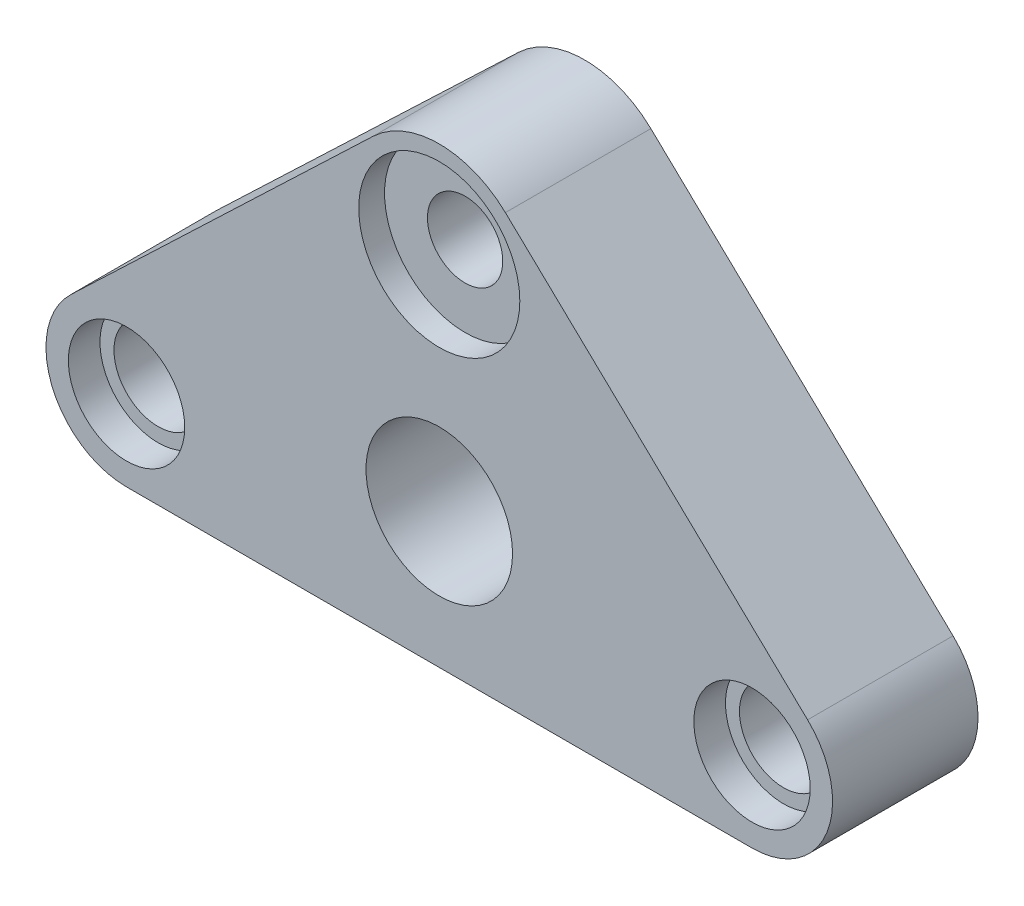
ISO-10303-21;
HEADER;
FILE_DESCRIPTION(('STEP AP214'),'2;1');
FILE_NAME('part.step','',(''),(''),'','','');
FILE_SCHEMA(('AUTOMOTIVE_DESIGN { 1 0 10303 214 1 1 1 1 }'));
ENDSEC;
DATA;
#1=APPLICATION_CONTEXT('core data for automotive mechanical design processes');
#2=APPLICATION_PROTOCOL_DEFINITION('international standard','automotive_design',2000,#1);
#3=PRODUCT_CONTEXT('',#1,'mechanical');
#4=PRODUCT('Part','Part','',(#3));
#5=PRODUCT_RELATED_PRODUCT_CATEGORY('part','',(#4));
#6=PRODUCT_DEFINITION_FORMATION('','',#4);
#7=PRODUCT_DEFINITION_CONTEXT('part definition',#1,'design');
#8=PRODUCT_DEFINITION('design','',#6,#7);
#9=PRODUCT_DEFINITION_SHAPE('','',#8);
#10=(LENGTH_UNIT() NAMED_UNIT(*) SI_UNIT(.MILLI.,.METRE.));
#11=(NAMED_UNIT(*) PLANE_ANGLE_UNIT() SI_UNIT($,.RADIAN.));
#12=(NAMED_UNIT(*) SI_UNIT($,.STERADIAN.) SOLID_ANGLE_UNIT());
#13=UNCERTAINTY_MEASURE_WITH_UNIT(LENGTH_MEASURE(1.E-05),#10,'distance_accuracy_value','');
#14=(GEOMETRIC_REPRESENTATION_CONTEXT(3) GLOBAL_UNCERTAINTY_ASSIGNED_CONTEXT((#13)) GLOBAL_UNIT_ASSIGNED_CONTEXT((#10,
#11,#12)) REPRESENTATION_CONTEXT('',''));
#15=CARTESIAN_POINT('',(0.,0.,0.));
#16=DIRECTION('',(0.,0.,1.));
#17=DIRECTION('',(1.,0.,0.));
#18=AXIS2_PLACEMENT_3D('',#15,#16,#17);
#19=CARTESIAN_POINT('',(43.,-38.0985892127255,20.));
#20=DIRECTION('',(0.,0.,-1.));
#21=DIRECTION('',(-1.,0.,0.));
#22=AXIS2_PLACEMENT_3D('',#19,#20,#21);
#23=CYLINDRICAL_SURFACE('',#22,6.075);
#24=CARTESIAN_POINT('',(43.,-38.0985892127255,4.35));
#25=DIRECTION('',(0.,0.,-1.));
#26=DIRECTION('',(-1.,0.,0.));
#27=AXIS2_PLACEMENT_3D('',#24,#25,#26);
#28=CIRCLE('',#27,6.075);
#29=CARTESIAN_POINT('',(36.925,-38.0985892127255,4.35));
#30=VERTEX_POINT('',#29);
#31=EDGE_CURVE('E148',#30,#30,#28,.T.);
#32=ORIENTED_EDGE('',*,*,#31,.T.);
#33=EDGE_LOOP('',(#32));
#34=FACE_BOUND('',#33,.T.);
#35=CARTESIAN_POINT('',(43.,-38.0985892127255,15.65));
#36=DIRECTION('',(0.,0.,1.));
#37=DIRECTION('',(1.,0.,0.));
#38=AXIS2_PLACEMENT_3D('',#35,#36,#37);
#39=CIRCLE('',#38,6.075);
#40=CARTESIAN_POINT('',(49.075,-38.0985892127255,15.65));
#41=VERTEX_POINT('',#40);
#42=EDGE_CURVE('E39',#41,#41,#39,.T.);
#43=ORIENTED_EDGE('',*,*,#42,.T.);
#44=EDGE_LOOP('',(#43));
#45=FACE_BOUND('',#44,.T.);
#46=ADVANCED_FACE('F35',(#34,#45),#23,.F.);
#47=CARTESIAN_POINT('',(-43.,-38.0985892127255,20.));
#48=DIRECTION('',(0.,0.,-1.));
#49=DIRECTION('',(-1.,0.,0.));
#50=AXIS2_PLACEMENT_3D('',#47,#48,#49);
#51=CYLINDRICAL_SURFACE('',#50,6.075);
#52=CARTESIAN_POINT('',(-43.,-38.0985892127255,4.35));
#53=DIRECTION('',(0.,0.,-1.));
#54=DIRECTION('',(-1.,0.,0.));
#55=AXIS2_PLACEMENT_3D('',#52,#53,#54);
#56=CIRCLE('',#55,6.075);
#57=CARTESIAN_POINT('',(-49.075,-38.0985892127255,4.35));
#58=VERTEX_POINT('',#57);
#59=EDGE_CURVE('E143',#58,#58,#56,.T.);
#60=ORIENTED_EDGE('',*,*,#59,.T.);
#61=EDGE_LOOP('',(#60));
#62=FACE_BOUND('',#61,.T.);
#63=CARTESIAN_POINT('',(-43.,-38.0985892127255,15.65));
#64=DIRECTION('',(0.,0.,1.));
#65=DIRECTION('',(1.,0.,0.));
#66=AXIS2_PLACEMENT_3D('',#63,#64,#65);
#67=CIRCLE('',#66,6.075);
#68=CARTESIAN_POINT('',(-36.925,-38.0985892127255,15.65));
#69=VERTEX_POINT('',#68);
#70=EDGE_CURVE('E152',#69,#69,#67,.T.);
#71=ORIENTED_EDGE('',*,*,#70,.T.);
#72=EDGE_LOOP('',(#71));
#73=FACE_BOUND('',#72,.T.);
#74=ADVANCED_FACE('F209',(#62,#73),#51,.F.);
#75=CARTESIAN_POINT('',(0.,0.,20.));
#76=DIRECTION('',(0.,0.,-1.));
#77=DIRECTION('',(-1.,0.,0.));
#78=AXIS2_PLACEMENT_3D('',#75,#76,#77);
#79=CYLINDRICAL_SURFACE('',#78,5.175);
#80=CARTESIAN_POINT('',(0.,0.,0.));
#81=DIRECTION('',(0.,0.,1.));
#82=DIRECTION('',(1.,0.,0.));
#83=AXIS2_PLACEMENT_3D('',#80,#81,#82);
#84=CIRCLE('',#83,5.175);
#85=CARTESIAN_POINT('',(5.175,0.,0.));
#86=VERTEX_POINT('',#85);
#87=EDGE_CURVE('E126',#86,#86,#84,.T.);
#88=ORIENTED_EDGE('',*,*,#87,.F.);
#89=EDGE_LOOP('',(#88));
#90=FACE_BOUND('',#89,.T.);
#91=CARTESIAN_POINT('',(0.,0.,16.45));
#92=DIRECTION('',(0.,0.,1.));
#93=DIRECTION('',(1.,0.,0.));
#94=AXIS2_PLACEMENT_3D('',#91,#92,#93);
#95=CIRCLE('',#94,5.175);
#96=CARTESIAN_POINT('',(5.175,0.,16.45));
#97=VERTEX_POINT('',#96);
#98=EDGE_CURVE('E139',#97,#97,#95,.T.);
#99=ORIENTED_EDGE('',*,*,#98,.T.);
#100=EDGE_LOOP('',(#99));
#101=FACE_BOUND('',#100,.T.);
#102=ADVANCED_FACE('F215',(#90,#101),#79,.F.);
#103=CARTESIAN_POINT('',(0.,0.,20.));
#104=DIRECTION('',(0.,0.,1.));
#105=DIRECTION('',(1.,0.,0.));
#106=AXIS2_PLACEMENT_3D('',#103,#104,#105);
#107=PLANE('',#106);
#108=CARTESIAN_POINT('',(0.,-30.5935892127255,20.));
#109=DIRECTION('',(0.,0.,1.));
#110=DIRECTION('',(1.,0.,0.));
#111=AXIS2_PLACEMENT_3D('',#108,#109,#110);
#112=CIRCLE('',#111,10.075);
#113=CARTESIAN_POINT('',(10.075,-30.5935892127255,20.));
#114=VERTEX_POINT('',#113);
#115=EDGE_CURVE('E297',#114,#114,#112,.T.);
#116=ORIENTED_EDGE('',*,*,#115,.F.);
#117=EDGE_LOOP('',(#116));
#118=FACE_BOUND('',#117,.T.);
#119=CARTESIAN_POINT('',(43.,-38.0985892127255,20.));
#120=DIRECTION('',(0.,0.,1.));
#121=DIRECTION('',(1.,0.,0.));
#122=AXIS2_PLACEMENT_3D('',#119,#120,#121);
#123=CIRCLE('',#122,8.);
#124=CARTESIAN_POINT('',(51.,-38.0985892127255,20.));
#125=VERTEX_POINT('',#124);
#126=EDGE_CURVE('E168',#125,#125,#123,.T.);
#127=ORIENTED_EDGE('',*,*,#126,.F.);
#128=EDGE_LOOP('',(#127));
#129=FACE_BOUND('',#128,.T.);
#130=CARTESIAN_POINT('',(-43.,-38.0985892127255,20.));
#131=DIRECTION('',(0.,0.,1.));
#132=DIRECTION('',(1.,0.,0.));
#133=AXIS2_PLACEMENT_3D('',#130,#131,#132);
#134=CIRCLE('',#133,8.);
#135=CARTESIAN_POINT('',(-35.,-38.0985892127255,20.));
#136=VERTEX_POINT('',#135);
#137=EDGE_CURVE('E161',#136,#136,#134,.T.);
#138=ORIENTED_EDGE('',*,*,#137,.F.);
#139=EDGE_LOOP('',(#138));
#140=FACE_BOUND('',#139,.T.);
#141=CARTESIAN_POINT('',(0.,0.,20.));
#142=DIRECTION('',(0.,0.,1.));
#143=DIRECTION('',(1.,0.,0.));
#144=AXIS2_PLACEMENT_3D('',#141,#142,#143);
#145=CIRCLE('',#144,11.075);
#146=CARTESIAN_POINT('',(11.075,0.,20.));
#147=VERTEX_POINT('',#146);
#148=EDGE_CURVE('E146',#147,#147,#145,.T.);
#149=ORIENTED_EDGE('',*,*,#148,.F.);
#150=EDGE_LOOP('',(#149));
#151=FACE_BOUND('',#150,.T.);
#152=CARTESIAN_POINT('',(0.,0.,20.));
#153=DIRECTION('',(0.,0.,1.));
#154=DIRECTION('',(1.,0.,0.));
#155=AXIS2_PLACEMENT_3D('',#152,#153,#154);
#156=CIRCLE('',#155,13.175);
#157=CARTESIAN_POINT('',(9.09176578504744,9.53521997175948,20.));
#158=VERTEX_POINT('',#157);
#159=CARTESIAN_POINT('',(-9.09176578504744,9.53521997175948,20.));
#160=VERTEX_POINT('',#159);
#161=EDGE_CURVE('E133',#158,#160,#156,.T.);
#162=ORIENTED_EDGE('',*,*,#161,.T.);
#163=DIRECTION('',(-0.723735861234116,-0.690077099434341,0.));
#164=VECTOR('',#163,1.);
#165=CARTESIAN_POINT('',(-9.09176578504744,9.53521997175948,20.));
#166=LINE('',#165,#164);
#167=CARTESIAN_POINT('',(-50.6426038762353,-30.0832145495576,20.));
#168=VERTEX_POINT('',#167);
#169=EDGE_CURVE('E91',#160,#168,#166,.T.);
#170=ORIENTED_EDGE('',*,*,#169,.T.);
#171=CARTESIAN_POINT('',(-43.,-38.0985892127255,20.));
#172=DIRECTION('',(0.,0.,1.));
#173=DIRECTION('',(1.,0.,0.));
#174=AXIS2_PLACEMENT_3D('',#171,#172,#173);
#175=CIRCLE('',#174,11.075);
#176=CARTESIAN_POINT('',(-43.,-49.1735892127255,20.));
#177=VERTEX_POINT('',#176);
#178=EDGE_CURVE('E104',#168,#177,#175,.T.);
#179=ORIENTED_EDGE('',*,*,#178,.T.);
#180=DIRECTION('',(1.,0.,0.));
#181=VECTOR('',#180,1.);
#182=CARTESIAN_POINT('',(-43.,-49.1735892127255,20.));
#183=LINE('',#182,#181);
#184=CARTESIAN_POINT('',(43.,-49.1735892127254,20.));
#185=VERTEX_POINT('',#184);
#186=EDGE_CURVE('E98',#177,#185,#183,.T.);
#187=ORIENTED_EDGE('',*,*,#186,.T.);
#188=CARTESIAN_POINT('',(43.,-38.0985892127255,20.));
#189=DIRECTION('',(0.,0.,1.));
#190=DIRECTION('',(1.,0.,0.));
#191=AXIS2_PLACEMENT_3D('',#188,#189,#190);
#192=CIRCLE('',#191,11.075);
#193=CARTESIAN_POINT('',(50.6426038762353,-30.0832145495576,20.));
#194=VERTEX_POINT('',#193);
#195=EDGE_CURVE('E102',#185,#194,#192,.T.);
#196=ORIENTED_EDGE('',*,*,#195,.T.);
#197=DIRECTION('',(-0.723735861234116,0.690077099434341,0.));
#198=VECTOR('',#197,1.);
#199=CARTESIAN_POINT('',(9.09176578504744,9.53521997175948,20.));
#200=LINE('',#199,#198);
#201=EDGE_CURVE('E54',#194,#158,#200,.T.);
#202=ORIENTED_EDGE('',*,*,#201,.T.);
#203=EDGE_LOOP('',(#162,#170,#179,#187,#196,#202));
#204=FACE_BOUND('',#203,.T.);
#205=ADVANCED_FACE('F100',(#118,#129,#140,#151,#204),#107,.T.);
#206=CARTESIAN_POINT('',(0.,0.,0.));
#207=DIRECTION('',(0.,0.,1.));
#208=DIRECTION('',(1.,0.,0.));
#209=AXIS2_PLACEMENT_3D('',#206,#207,#208);
#210=PLANE('',#209);
#211=CARTESIAN_POINT('',(0.,-30.5935892127255,0.));
#212=DIRECTION('',(0.,0.,1.));
#213=DIRECTION('',(1.,0.,0.));
#214=AXIS2_PLACEMENT_3D('',#211,#212,#213);
#215=CIRCLE('',#214,1.75);
#216=CARTESIAN_POINT('',(1.75,-30.5935892127255,0.));
#217=VERTEX_POINT('',#216);
#218=EDGE_CURVE('E235',#217,#217,#215,.F.);
#219=ORIENTED_EDGE('',*,*,#218,.F.);
#220=EDGE_LOOP('',(#219));
#221=FACE_BOUND('',#220,.T.);
#222=CARTESIAN_POINT('',(43.,-38.0985892127255,0.));
#223=DIRECTION('',(0.,0.,-1.));
#224=DIRECTION('',(-1.,0.,0.));
#225=AXIS2_PLACEMENT_3D('',#222,#223,#224);
#226=CIRCLE('',#225,8.);
#227=CARTESIAN_POINT('',(35.,-38.0985892127255,0.));
#228=VERTEX_POINT('',#227);
#229=EDGE_CURVE('E154',#228,#228,#226,.T.);
#230=ORIENTED_EDGE('',*,*,#229,.F.);
#231=EDGE_LOOP('',(#230));
#232=FACE_BOUND('',#231,.T.);
#233=CARTESIAN_POINT('',(-43.,-38.0985892127255,0.));
#234=DIRECTION('',(0.,0.,-1.));
#235=DIRECTION('',(-1.,0.,0.));
#236=AXIS2_PLACEMENT_3D('',#233,#234,#235);
#237=CIRCLE('',#236,8.);
#238=CARTESIAN_POINT('',(-51.,-38.0985892127255,0.));
#239=VERTEX_POINT('',#238);
#240=EDGE_CURVE('E150',#239,#239,#237,.T.);
#241=ORIENTED_EDGE('',*,*,#240,.F.);
#242=EDGE_LOOP('',(#241));
#243=FACE_BOUND('',#242,.T.);
#244=CARTESIAN_POINT('',(0.,0.,0.));
#245=DIRECTION('',(0.,0.,1.));
#246=DIRECTION('',(1.,0.,0.));
#247=AXIS2_PLACEMENT_3D('',#244,#245,#246);
#248=CIRCLE('',#247,13.175);
#249=CARTESIAN_POINT('',(9.09176578504744,9.53521997175948,0.));
#250=VERTEX_POINT('',#249);
#251=CARTESIAN_POINT('',(-9.09176578504744,9.53521997175948,0.));
#252=VERTEX_POINT('',#251);
#253=EDGE_CURVE('E122',#250,#252,#248,.T.);
#254=ORIENTED_EDGE('',*,*,#253,.F.);
#255=DIRECTION('',(-0.723735861234116,0.690077099434341,0.));
#256=VECTOR('',#255,1.);
#257=CARTESIAN_POINT('',(9.09176578504744,9.53521997175948,0.));
#258=LINE('',#257,#256);
#259=CARTESIAN_POINT('',(50.6426038762353,-30.0832145495576,0.));
#260=VERTEX_POINT('',#259);
#261=EDGE_CURVE('E83',#260,#250,#258,.T.);
#262=ORIENTED_EDGE('',*,*,#261,.F.);
#263=CARTESIAN_POINT('',(43.,-38.0985892127255,0.));
#264=DIRECTION('',(0.,0.,1.));
#265=DIRECTION('',(1.,0.,0.));
#266=AXIS2_PLACEMENT_3D('',#263,#264,#265);
#267=CIRCLE('',#266,11.075);
#268=CARTESIAN_POINT('',(43.,-49.1735892127254,0.));
#269=VERTEX_POINT('',#268);
#270=EDGE_CURVE('E77',#269,#260,#267,.T.);
#271=ORIENTED_EDGE('',*,*,#270,.F.);
#272=DIRECTION('',(1.,0.,0.));
#273=VECTOR('',#272,1.);
#274=CARTESIAN_POINT('',(-43.,-49.1735892127255,0.));
#275=LINE('',#274,#273);
#276=CARTESIAN_POINT('',(-43.,-49.1735892127255,0.));
#277=VERTEX_POINT('',#276);
#278=EDGE_CURVE('E112',#277,#269,#275,.T.);
#279=ORIENTED_EDGE('',*,*,#278,.F.);
#280=CARTESIAN_POINT('',(-43.,-38.0985892127255,0.));
#281=DIRECTION('',(0.,0.,1.));
#282=DIRECTION('',(1.,0.,0.));
#283=AXIS2_PLACEMENT_3D('',#280,#281,#282);
#284=CIRCLE('',#283,11.075);
#285=CARTESIAN_POINT('',(-50.6426038762353,-30.0832145495576,0.));
#286=VERTEX_POINT('',#285);
#287=EDGE_CURVE('E128',#286,#277,#284,.T.);
#288=ORIENTED_EDGE('',*,*,#287,.F.);
#289=DIRECTION('',(-0.723735861234116,-0.690077099434341,0.));
#290=VECTOR('',#289,1.);
#291=CARTESIAN_POINT('',(-9.09176578504744,9.53521997175948,0.));
#292=LINE('',#291,#290);
#293=EDGE_CURVE('E125',#252,#286,#292,.T.);
#294=ORIENTED_EDGE('',*,*,#293,.F.);
#295=EDGE_LOOP('',(#254,#262,#271,#279,#288,#294));
#296=FACE_BOUND('',#295,.T.);
#297=ORIENTED_EDGE('',*,*,#87,.T.);
#298=EDGE_LOOP('',(#297));
#299=FACE_BOUND('',#298,.T.);
#300=ADVANCED_FACE('F192',(#221,#232,#243,#296,#299),#210,.F.);
#301=CARTESIAN_POINT('',(0.,0.,20.));
#302=DIRECTION('',(0.,0.,-1.));
#303=DIRECTION('',(-1.,0.,0.));
#304=AXIS2_PLACEMENT_3D('',#301,#302,#303);
#305=CYLINDRICAL_SURFACE('',#304,13.175);
#306=ORIENTED_EDGE('',*,*,#253,.T.);
#307=DIRECTION('',(0.,0.,-1.));
#308=VECTOR('',#307,1.);
#309=CARTESIAN_POINT('',(-9.09176578504744,9.53521997175948,20.));
#310=LINE('',#309,#308);
#311=EDGE_CURVE('E11',#160,#252,#310,.T.);
#312=ORIENTED_EDGE('',*,*,#311,.F.);
#313=ORIENTED_EDGE('',*,*,#161,.F.);
#314=DIRECTION('',(0.,0.,-1.));
#315=VECTOR('',#314,1.);
#316=CARTESIAN_POINT('',(9.09176578504744,9.53521997175948,20.));
#317=LINE('',#316,#315);
#318=EDGE_CURVE('E118',#158,#250,#317,.T.);
#319=ORIENTED_EDGE('',*,*,#318,.T.);
#320=EDGE_LOOP('',(#306,#312,#313,#319));
#321=FACE_BOUND('',#320,.T.);
#322=ADVANCED_FACE('F37',(#321),#305,.T.);
#323=CARTESIAN_POINT('',(-9.09176578504744,9.53521997175948,20.));
#324=DIRECTION('',(0.690077099434341,-0.723735861234116,0.));
#325=DIRECTION('',(0.723735861234116,0.690077099434341,0.));
#326=AXIS2_PLACEMENT_3D('',#323,#324,#325);
#327=PLANE('',#326);
#328=ORIENTED_EDGE('',*,*,#293,.T.);
#329=DIRECTION('',(0.,0.,-1.));
#330=VECTOR('',#329,1.);
#331=CARTESIAN_POINT('',(-50.6426038762353,-30.0832145495576,20.));
#332=LINE('',#331,#330);
#333=EDGE_CURVE('E45',#168,#286,#332,.T.);
#334=ORIENTED_EDGE('',*,*,#333,.F.);
#335=ORIENTED_EDGE('',*,*,#169,.F.);
#336=ORIENTED_EDGE('',*,*,#311,.T.);
#337=EDGE_LOOP('',(#328,#334,#335,#336));
#338=FACE_BOUND('',#337,.T.);
#339=ADVANCED_FACE('F186',(#338),#327,.F.);
#340=CARTESIAN_POINT('',(-43.,-38.0985892127255,20.));
#341=DIRECTION('',(0.,0.,-1.));
#342=DIRECTION('',(-1.,0.,0.));
#343=AXIS2_PLACEMENT_3D('',#340,#341,#342);
#344=CYLINDRICAL_SURFACE('',#343,11.075);
#345=ORIENTED_EDGE('',*,*,#287,.T.);
#346=DIRECTION('',(0.,0.,-1.));
#347=VECTOR('',#346,1.);
#348=CARTESIAN_POINT('',(-43.,-49.1735892127255,20.));
#349=LINE('',#348,#347);
#350=EDGE_CURVE('E113',#177,#277,#349,.T.);
#351=ORIENTED_EDGE('',*,*,#350,.F.);
#352=ORIENTED_EDGE('',*,*,#178,.F.);
#353=ORIENTED_EDGE('',*,*,#333,.T.);
#354=EDGE_LOOP('',(#345,#351,#352,#353));
#355=FACE_BOUND('',#354,.T.);
#356=ADVANCED_FACE('F189',(#355),#344,.T.);
#357=CARTESIAN_POINT('',(-43.,-49.1735892127255,20.));
#358=DIRECTION('',(0.,1.,0.));
#359=DIRECTION('',(-1.,0.,0.));
#360=AXIS2_PLACEMENT_3D('',#357,#358,#359);
#361=PLANE('',#360);
#362=ORIENTED_EDGE('',*,*,#278,.T.);
#363=DIRECTION('',(0.,0.,-1.));
#364=VECTOR('',#363,1.);
#365=CARTESIAN_POINT('',(43.,-49.1735892127254,20.));
#366=LINE('',#365,#364);
#367=EDGE_CURVE('E109',#185,#269,#366,.T.);
#368=ORIENTED_EDGE('',*,*,#367,.F.);
#369=ORIENTED_EDGE('',*,*,#186,.F.);
#370=ORIENTED_EDGE('',*,*,#350,.T.);
#371=EDGE_LOOP('',(#362,#368,#369,#370));
#372=FACE_BOUND('',#371,.T.);
#373=ADVANCED_FACE('F110',(#372),#361,.F.);
#374=CARTESIAN_POINT('',(43.,-38.0985892127255,20.));
#375=DIRECTION('',(0.,0.,-1.));
#376=DIRECTION('',(-1.,0.,0.));
#377=AXIS2_PLACEMENT_3D('',#374,#375,#376);
#378=CYLINDRICAL_SURFACE('',#377,11.075);
#379=ORIENTED_EDGE('',*,*,#270,.T.);
#380=DIRECTION('',(0.,0.,-1.));
#381=VECTOR('',#380,1.);
#382=CARTESIAN_POINT('',(50.6426038762353,-30.0832145495576,20.));
#383=LINE('',#382,#381);
#384=EDGE_CURVE('E114',#194,#260,#383,.T.);
#385=ORIENTED_EDGE('',*,*,#384,.F.);
#386=ORIENTED_EDGE('',*,*,#195,.F.);
#387=ORIENTED_EDGE('',*,*,#367,.T.);
#388=EDGE_LOOP('',(#379,#385,#386,#387));
#389=FACE_BOUND('',#388,.T.);
#390=ADVANCED_FACE('F116',(#389),#378,.T.);
#391=CARTESIAN_POINT('',(9.09176578504744,9.53521997175948,20.));
#392=DIRECTION('',(-0.690077099434341,-0.723735861234116,0.));
#393=DIRECTION('',(0.723735861234116,-0.690077099434341,0.));
#394=AXIS2_PLACEMENT_3D('',#391,#392,#393);
#395=PLANE('',#394);
#396=ORIENTED_EDGE('',*,*,#261,.T.);
#397=ORIENTED_EDGE('',*,*,#318,.F.);
#398=ORIENTED_EDGE('',*,*,#201,.F.);
#399=ORIENTED_EDGE('',*,*,#384,.T.);
#400=EDGE_LOOP('',(#396,#397,#398,#399));
#401=FACE_BOUND('',#400,.T.);
#402=ADVANCED_FACE('F195',(#401),#395,.F.);
#403=CARTESIAN_POINT('',(0.,0.,16.45));
#404=DIRECTION('',(0.,0.,1.));
#405=DIRECTION('',(1.,0.,0.));
#406=AXIS2_PLACEMENT_3D('',#403,#404,#405);
#407=CYLINDRICAL_SURFACE('',#406,11.075);
#408=CARTESIAN_POINT('',(0.,0.,16.45));
#409=DIRECTION('',(0.,0.,1.));
#410=DIRECTION('',(1.,0.,0.));
#411=AXIS2_PLACEMENT_3D('',#408,#409,#410);
#412=CIRCLE('',#411,11.075);
#413=CARTESIAN_POINT('',(11.075,0.,16.45));
#414=VERTEX_POINT('',#413);
#415=EDGE_CURVE('E142',#414,#414,#412,.T.);
#416=ORIENTED_EDGE('',*,*,#415,.F.);
#417=EDGE_LOOP('',(#416));
#418=FACE_BOUND('',#417,.T.);
#419=ORIENTED_EDGE('',*,*,#148,.T.);
#420=EDGE_LOOP('',(#419));
#421=FACE_BOUND('',#420,.T.);
#422=ADVANCED_FACE('F197',(#418,#421),#407,.F.);
#423=CARTESIAN_POINT('',(0.,0.,16.45));
#424=DIRECTION('',(0.,0.,1.));
#425=DIRECTION('',(1.,0.,0.));
#426=AXIS2_PLACEMENT_3D('',#423,#424,#425);
#427=PLANE('',#426);
#428=ORIENTED_EDGE('',*,*,#98,.F.);
#429=EDGE_LOOP('',(#428));
#430=FACE_BOUND('',#429,.T.);
#431=ORIENTED_EDGE('',*,*,#415,.T.);
#432=EDGE_LOOP('',(#431));
#433=FACE_BOUND('',#432,.T.);
#434=ADVANCED_FACE('F203',(#430,#433),#427,.T.);
#435=CARTESIAN_POINT('',(-43.,-38.0985892127255,4.35));
#436=DIRECTION('',(0.,0.,-1.));
#437=DIRECTION('',(-1.,0.,0.));
#438=AXIS2_PLACEMENT_3D('',#435,#436,#437);
#439=CYLINDRICAL_SURFACE('',#438,8.);
#440=CARTESIAN_POINT('',(-43.,-38.0985892127255,4.35));
#441=DIRECTION('',(0.,0.,-1.));
#442=DIRECTION('',(-1.,0.,0.));
#443=AXIS2_PLACEMENT_3D('',#440,#441,#442);
#444=CIRCLE('',#443,8.);
#445=CARTESIAN_POINT('',(-51.,-38.0985892127255,4.35));
#446=VERTEX_POINT('',#445);
#447=EDGE_CURVE('E147',#446,#446,#444,.T.);
#448=ORIENTED_EDGE('',*,*,#447,.F.);
#449=EDGE_LOOP('',(#448));
#450=FACE_BOUND('',#449,.T.);
#451=ORIENTED_EDGE('',*,*,#240,.T.);
#452=EDGE_LOOP('',(#451));
#453=FACE_BOUND('',#452,.T.);
#454=ADVANCED_FACE('F240',(#450,#453),#439,.F.);
#455=CARTESIAN_POINT('',(-43.,-38.0985892127255,4.35));
#456=DIRECTION('',(0.,0.,-1.));
#457=DIRECTION('',(-1.,0.,0.));
#458=AXIS2_PLACEMENT_3D('',#455,#456,#457);
#459=PLANE('',#458);
#460=ORIENTED_EDGE('',*,*,#59,.F.);
#461=EDGE_LOOP('',(#460));
#462=FACE_BOUND('',#461,.T.);
#463=ORIENTED_EDGE('',*,*,#447,.T.);
#464=EDGE_LOOP('',(#463));
#465=FACE_BOUND('',#464,.T.);
#466=ADVANCED_FACE('F242',(#462,#465),#459,.T.);
#467=CARTESIAN_POINT('',(43.,-38.0985892127255,4.35));
#468=DIRECTION('',(0.,0.,-1.));
#469=DIRECTION('',(-1.,0.,0.));
#470=AXIS2_PLACEMENT_3D('',#467,#468,#469);
#471=CYLINDRICAL_SURFACE('',#470,8.);
#472=CARTESIAN_POINT('',(43.,-38.0985892127255,4.35));
#473=DIRECTION('',(0.,0.,-1.));
#474=DIRECTION('',(-1.,0.,0.));
#475=AXIS2_PLACEMENT_3D('',#472,#473,#474);
#476=CIRCLE('',#475,8.);
#477=CARTESIAN_POINT('',(35.,-38.0985892127255,4.35));
#478=VERTEX_POINT('',#477);
#479=EDGE_CURVE('E151',#478,#478,#476,.T.);
#480=ORIENTED_EDGE('',*,*,#479,.F.);
#481=EDGE_LOOP('',(#480));
#482=FACE_BOUND('',#481,.T.);
#483=ORIENTED_EDGE('',*,*,#229,.T.);
#484=EDGE_LOOP('',(#483));
#485=FACE_BOUND('',#484,.T.);
#486=ADVANCED_FACE('F249',(#482,#485),#471,.F.);
#487=CARTESIAN_POINT('',(43.,-38.0985892127255,4.35));
#488=DIRECTION('',(0.,0.,-1.));
#489=DIRECTION('',(-1.,0.,0.));
#490=AXIS2_PLACEMENT_3D('',#487,#488,#489);
#491=PLANE('',#490);
#492=ORIENTED_EDGE('',*,*,#31,.F.);
#493=EDGE_LOOP('',(#492));
#494=FACE_BOUND('',#493,.T.);
#495=ORIENTED_EDGE('',*,*,#479,.T.);
#496=EDGE_LOOP('',(#495));
#497=FACE_BOUND('',#496,.T.);
#498=ADVANCED_FACE('F258',(#494,#497),#491,.T.);
#499=CARTESIAN_POINT('',(-43.,-38.0985892127255,15.65));
#500=DIRECTION('',(0.,0.,1.));
#501=DIRECTION('',(1.,0.,0.));
#502=AXIS2_PLACEMENT_3D('',#499,#500,#501);
#503=CYLINDRICAL_SURFACE('',#502,8.);
#504=CARTESIAN_POINT('',(-43.,-38.0985892127255,15.65));
#505=DIRECTION('',(0.,0.,1.));
#506=DIRECTION('',(1.,0.,0.));
#507=AXIS2_PLACEMENT_3D('',#504,#505,#506);
#508=CIRCLE('',#507,8.);
#509=CARTESIAN_POINT('',(-35.,-38.0985892127255,15.65));
#510=VERTEX_POINT('',#509);
#511=EDGE_CURVE('E155',#510,#510,#508,.T.);
#512=ORIENTED_EDGE('',*,*,#511,.F.);
#513=EDGE_LOOP('',(#512));
#514=FACE_BOUND('',#513,.T.);
#515=ORIENTED_EDGE('',*,*,#137,.T.);
#516=EDGE_LOOP('',(#515));
#517=FACE_BOUND('',#516,.T.);
#518=ADVANCED_FACE('F262',(#514,#517),#503,.F.);
#519=CARTESIAN_POINT('',(-43.,-38.0985892127255,15.65));
#520=DIRECTION('',(0.,0.,1.));
#521=DIRECTION('',(1.,0.,0.));
#522=AXIS2_PLACEMENT_3D('',#519,#520,#521);
#523=PLANE('',#522);
#524=ORIENTED_EDGE('',*,*,#70,.F.);
#525=EDGE_LOOP('',(#524));
#526=FACE_BOUND('',#525,.T.);
#527=ORIENTED_EDGE('',*,*,#511,.T.);
#528=EDGE_LOOP('',(#527));
#529=FACE_BOUND('',#528,.T.);
#530=ADVANCED_FACE('F266',(#526,#529),#523,.T.);
#531=CARTESIAN_POINT('',(43.,-38.0985892127255,15.65));
#532=DIRECTION('',(0.,0.,1.));
#533=DIRECTION('',(1.,0.,0.));
#534=AXIS2_PLACEMENT_3D('',#531,#532,#533);
#535=CYLINDRICAL_SURFACE('',#534,8.);
#536=CARTESIAN_POINT('',(43.,-38.0985892127255,15.65));
#537=DIRECTION('',(0.,0.,1.));
#538=DIRECTION('',(1.,0.,0.));
#539=AXIS2_PLACEMENT_3D('',#536,#537,#538);
#540=CIRCLE('',#539,8.);
#541=CARTESIAN_POINT('',(51.,-38.0985892127255,15.65));
#542=VERTEX_POINT('',#541);
#543=EDGE_CURVE('E304',#542,#542,#540,.T.);
#544=ORIENTED_EDGE('',*,*,#543,.F.);
#545=EDGE_LOOP('',(#544));
#546=FACE_BOUND('',#545,.T.);
#547=ORIENTED_EDGE('',*,*,#126,.T.);
#548=EDGE_LOOP('',(#547));
#549=FACE_BOUND('',#548,.T.);
#550=ADVANCED_FACE('F270',(#546,#549),#535,.F.);
#551=CARTESIAN_POINT('',(43.,-38.0985892127255,15.65));
#552=DIRECTION('',(0.,0.,1.));
#553=DIRECTION('',(1.,0.,0.));
#554=AXIS2_PLACEMENT_3D('',#551,#552,#553);
#555=PLANE('',#554);
#556=ORIENTED_EDGE('',*,*,#42,.F.);
#557=EDGE_LOOP('',(#556));
#558=FACE_BOUND('',#557,.T.);
#559=ORIENTED_EDGE('',*,*,#543,.T.);
#560=EDGE_LOOP('',(#559));
#561=FACE_BOUND('',#560,.T.);
#562=ADVANCED_FACE('F274',(#558,#561),#555,.T.);
#563=CARTESIAN_POINT('',(0.,-30.5935892127255,5.));
#564=DIRECTION('',(0.,0.,1.));
#565=DIRECTION('',(1.,0.,0.));
#566=AXIS2_PLACEMENT_3D('',#563,#564,#565);
#567=CYLINDRICAL_SURFACE('',#566,10.075);
#568=CARTESIAN_POINT('',(0.,-30.5935892127255,5.));
#569=DIRECTION('',(0.,0.,1.));
#570=DIRECTION('',(1.,0.,0.));
#571=AXIS2_PLACEMENT_3D('',#568,#569,#570);
#572=CIRCLE('',#571,10.075);
#573=CARTESIAN_POINT('',(10.075,-30.5935892127255,5.));
#574=VERTEX_POINT('',#573);
#575=EDGE_CURVE('E300',#574,#574,#572,.T.);
#576=ORIENTED_EDGE('',*,*,#575,.F.);
#577=EDGE_LOOP('',(#576));
#578=FACE_BOUND('',#577,.T.);
#579=ORIENTED_EDGE('',*,*,#115,.T.);
#580=EDGE_LOOP('',(#579));
#581=FACE_BOUND('',#580,.T.);
#582=ADVANCED_FACE('F278',(#578,#581),#567,.F.);
#583=CARTESIAN_POINT('',(0.,-30.5935892127255,5.));
#584=DIRECTION('',(0.,0.,1.));
#585=DIRECTION('',(1.,0.,0.));
#586=AXIS2_PLACEMENT_3D('',#583,#584,#585);
#587=PLANE('',#586);
#588=CARTESIAN_POINT('',(0.,-30.5935892127255,5.));
#589=DIRECTION('',(0.,0.,1.));
#590=DIRECTION('',(1.,0.,0.));
#591=AXIS2_PLACEMENT_3D('',#588,#589,#590);
#592=CIRCLE('',#591,1.75);
#593=CARTESIAN_POINT('',(1.75,-30.5935892127255,5.));
#594=VERTEX_POINT('',#593);
#595=EDGE_CURVE('E295',#594,#594,#592,.T.);
#596=ORIENTED_EDGE('',*,*,#595,.F.);
#597=EDGE_LOOP('',(#596));
#598=FACE_BOUND('',#597,.T.);
#599=ORIENTED_EDGE('',*,*,#575,.T.);
#600=EDGE_LOOP('',(#599));
#601=FACE_BOUND('',#600,.T.);
#602=ADVANCED_FACE('F282',(#598,#601),#587,.T.);
#603=CARTESIAN_POINT('',(0.,-30.5935892127255,-4.94974746830584));
#604=DIRECTION('',(0.,0.,1.));
#605=DIRECTION('',(1.,0.,0.));
#606=AXIS2_PLACEMENT_3D('',#603,#604,#605);
#607=CYLINDRICAL_SURFACE('',#606,1.75);
#608=ORIENTED_EDGE('',*,*,#218,.T.);
#609=EDGE_LOOP('',(#608));
#610=FACE_BOUND('',#609,.T.);
#611=ORIENTED_EDGE('',*,*,#595,.T.);
#612=EDGE_LOOP('',(#611));
#613=FACE_BOUND('',#612,.T.);
#614=ADVANCED_FACE('F286',(#610,#613),#607,.F.);
#615=CLOSED_SHELL('',(#46,#74,#102,#205,#300,#322,#339,#356,#373,#390,#402,#422,#434,#454,#466,
#486,#498,#518,#530,#550,#562,#582,#602,#614));
#616=MANIFOLD_SOLID_BREP('B2',#615);
#617=ADVANCED_BREP_SHAPE_REPRESENTATION('',(#18,#616),#14);
#618=SHAPE_DEFINITION_REPRESENTATION(#9,#617);
ENDSEC;
END-ISO-10303-21;
